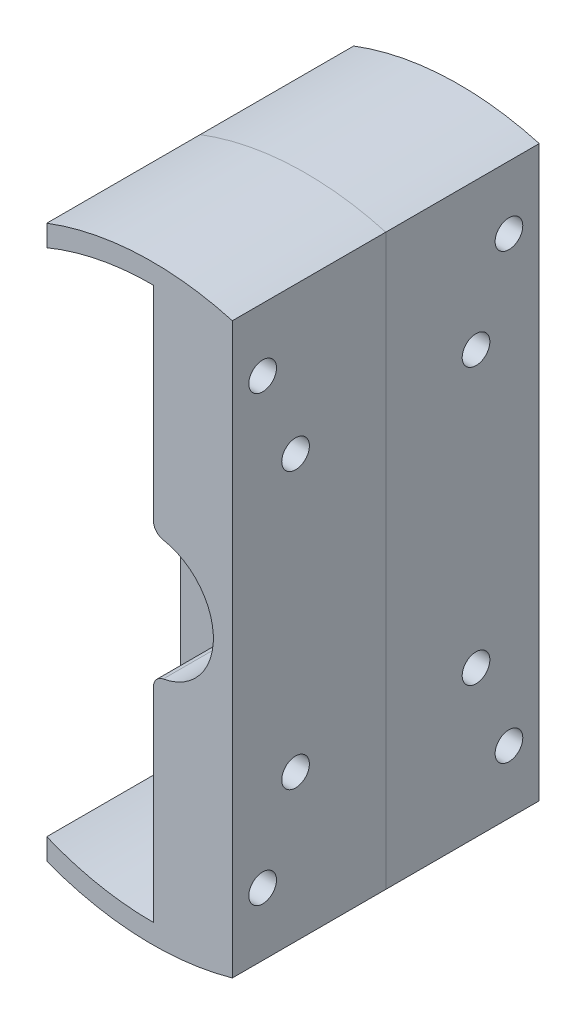
ISO-10303-21;
HEADER;
FILE_DESCRIPTION(('STEP AP214'),'2;1');
FILE_NAME('part.step','',(''),(''),'','','');
FILE_SCHEMA(('AUTOMOTIVE_DESIGN { 1 0 10303 214 1 1 1 1 }'));
ENDSEC;
DATA;
#1=APPLICATION_CONTEXT('core data for automotive mechanical design processes');
#2=APPLICATION_PROTOCOL_DEFINITION('international standard','automotive_design',2000,#1);
#3=PRODUCT_CONTEXT('',#1,'mechanical');
#4=PRODUCT('Part','Part','',(#3));
#5=PRODUCT_RELATED_PRODUCT_CATEGORY('part','',(#4));
#6=PRODUCT_DEFINITION_FORMATION('','',#4);
#7=PRODUCT_DEFINITION_CONTEXT('part definition',#1,'design');
#8=PRODUCT_DEFINITION('design','',#6,#7);
#9=PRODUCT_DEFINITION_SHAPE('','',#8);
#10=(LENGTH_UNIT() NAMED_UNIT(*) SI_UNIT(.MILLI.,.METRE.));
#11=(NAMED_UNIT(*) PLANE_ANGLE_UNIT() SI_UNIT($,.RADIAN.));
#12=(NAMED_UNIT(*) SI_UNIT($,.STERADIAN.) SOLID_ANGLE_UNIT());
#13=UNCERTAINTY_MEASURE_WITH_UNIT(LENGTH_MEASURE(1.E-05),#10,'distance_accuracy_value','');
#14=(GEOMETRIC_REPRESENTATION_CONTEXT(3) GLOBAL_UNCERTAINTY_ASSIGNED_CONTEXT((#13)) GLOBAL_UNIT_ASSIGNED_CONTEXT((#10,
#11,#12)) REPRESENTATION_CONTEXT('',''));
#15=CARTESIAN_POINT('',(0.,0.,0.));
#16=DIRECTION('',(0.,0.,1.));
#17=DIRECTION('',(1.,0.,0.));
#18=AXIS2_PLACEMENT_3D('',#15,#16,#17);
#19=CARTESIAN_POINT('',(0.,0.,-26.3));
#20=DIRECTION('',(0.,0.,-1.));
#21=DIRECTION('',(1.,0.,0.));
#22=AXIS2_PLACEMENT_3D('',#19,#20,#21);
#23=CYLINDRICAL_SURFACE('',#22,41.9000000000003);
#24=CARTESIAN_POINT('',(0.,0.,-46.6));
#25=DIRECTION('',(0.,0.,1.));
#26=DIRECTION('',(1.,0.,0.));
#27=AXIS2_PLACEMENT_3D('',#24,#25,#26);
#28=CIRCLE('',#27,41.9000000000003);
#29=CARTESIAN_POINT('',(-16.,-38.7247982564147,-46.6));
#30=VERTEX_POINT('',#29);
#31=CARTESIAN_POINT('',(0.199999999998424,-41.8995226703125,-46.6));
#32=VERTEX_POINT('',#31);
#33=EDGE_CURVE('E168',#30,#32,#28,.T.);
#34=ORIENTED_EDGE('',*,*,#33,.F.);
#35=DIRECTION('',(0.,0.,-1.));
#36=VECTOR('',#35,1.);
#37=CARTESIAN_POINT('',(-16.,-38.7247982564147,-26.3));
#38=LINE('',#37,#36);
#39=CARTESIAN_POINT('',(-16.,-38.7247982564147,-26.3));
#40=VERTEX_POINT('',#39);
#41=EDGE_CURVE('E167',#40,#30,#38,.T.);
#42=ORIENTED_EDGE('',*,*,#41,.F.);
#43=CARTESIAN_POINT('',(0.,0.,-26.3));
#44=DIRECTION('',(0.,0.,1.));
#45=DIRECTION('',(1.,0.,0.));
#46=AXIS2_PLACEMENT_3D('',#43,#44,#45);
#47=CIRCLE('',#46,41.9000000000003);
#48=CARTESIAN_POINT('',(0.199999999998424,-41.8995226703125,-26.3));
#49=VERTEX_POINT('',#48);
#50=EDGE_CURVE('E196',#40,#49,#47,.T.);
#51=ORIENTED_EDGE('',*,*,#50,.T.);
#52=DIRECTION('',(0.,0.,-1.));
#53=VECTOR('',#52,1.);
#54=CARTESIAN_POINT('',(0.199999999998424,-41.8995226703125,-26.3));
#55=LINE('',#54,#53);
#56=EDGE_CURVE('E12',#49,#32,#55,.T.);
#57=ORIENTED_EDGE('',*,*,#56,.T.);
#58=EDGE_LOOP('',(#34,#42,#51,#57));
#59=FACE_BOUND('',#58,.T.);
#60=ADVANCED_FACE('F53',(#59),#23,.F.);
#61=CARTESIAN_POINT('',(0.199999999998424,-41.5000000000045,-26.3));
#62=DIRECTION('',(1.,0.,0.));
#63=DIRECTION('',(0.,0.,1.));
#64=AXIS2_PLACEMENT_3D('',#61,#62,#63);
#65=PLANE('',#64);
#66=CARTESIAN_POINT('',(0.199999999998424,-20.9183332061263,-37.));
#67=DIRECTION('',(1.,0.,0.));
#68=DIRECTION('',(0.,0.,-1.));
#69=AXIS2_PLACEMENT_3D('',#66,#67,#68);
#70=CIRCLE('',#69,2.1);
#71=CARTESIAN_POINT('',(0.199999999998424,-20.9183332061263,-39.1));
#72=VERTEX_POINT('',#71);
#73=EDGE_CURVE('E286',#72,#72,#70,.T.);
#74=ORIENTED_EDGE('',*,*,#73,.T.);
#75=EDGE_LOOP('',(#74));
#76=FACE_BOUND('',#75,.T.);
#77=CARTESIAN_POINT('',(0.199999999998424,-33.6670833015316,-42.));
#78=DIRECTION('',(1.,0.,0.));
#79=DIRECTION('',(0.,0.,-1.));
#80=AXIS2_PLACEMENT_3D('',#77,#78,#79);
#81=CIRCLE('',#80,2.1);
#82=CARTESIAN_POINT('',(0.199999999998424,-33.6670833015316,-44.1));
#83=VERTEX_POINT('',#82);
#84=EDGE_CURVE('E291',#83,#83,#81,.T.);
#85=ORIENTED_EDGE('',*,*,#84,.T.);
#86=EDGE_LOOP('',(#85));
#87=FACE_BOUND('',#86,.T.);
#88=DIRECTION('',(0.,1.,0.));
#89=VECTOR('',#88,1.);
#90=CARTESIAN_POINT('',(0.199999999998424,-41.5000000000045,-46.6));
#91=LINE('',#90,#89);
#92=CARTESIAN_POINT('',(0.199999999998421,-10.9183332061265,-46.6));
#93=VERTEX_POINT('',#92);
#94=EDGE_CURVE('E170',#32,#93,#91,.T.);
#95=ORIENTED_EDGE('',*,*,#94,.F.);
#96=ORIENTED_EDGE('',*,*,#56,.F.);
#97=DIRECTION('',(0.,-1.,0.));
#98=VECTOR('',#97,1.);
#99=CARTESIAN_POINT('',(0.199999999998424,-41.5000000000045,-26.3));
#100=LINE('',#99,#98);
#101=CARTESIAN_POINT('',(0.199999999998421,-10.9183332061265,-26.3));
#102=VERTEX_POINT('',#101);
#103=EDGE_CURVE('E122',#102,#49,#100,.T.);
#104=ORIENTED_EDGE('',*,*,#103,.F.);
#105=DIRECTION('',(0.,0.,-1.));
#106=VECTOR('',#105,1.);
#107=CARTESIAN_POINT('',(0.199999999998421,-10.9183332061265,-26.3));
#108=LINE('',#107,#106);
#109=EDGE_CURVE('E61',#102,#93,#108,.T.);
#110=ORIENTED_EDGE('',*,*,#109,.T.);
#111=EDGE_LOOP('',(#95,#96,#104,#110));
#112=FACE_BOUND('',#111,.T.);
#113=ADVANCED_FACE('F219',(#76,#87,#112),#65,.F.);
#114=CARTESIAN_POINT('',(1.99999999999835,-10.9183332061264,-26.3));
#115=DIRECTION('',(0.,0.,-1.));
#116=DIRECTION('',(1.,0.,0.));
#117=AXIS2_PLACEMENT_3D('',#114,#115,#116);
#118=CYLINDRICAL_SURFACE('',#117,1.79999999999993);
#119=CARTESIAN_POINT('',(1.99999999999835,-10.9183332061264,-46.6));
#120=DIRECTION('',(0.,0.,1.));
#121=DIRECTION('',(1.,0.,0.));
#122=AXIS2_PLACEMENT_3D('',#119,#120,#121);
#123=CIRCLE('',#122,1.79999999999993);
#124=CARTESIAN_POINT('',(1.67567567567574,-9.14779268621378,-46.6));
#125=VERTEX_POINT('',#124);
#126=EDGE_CURVE('E174',#125,#93,#123,.T.);
#127=ORIENTED_EDGE('',*,*,#126,.T.);
#128=ORIENTED_EDGE('',*,*,#109,.F.);
#129=CARTESIAN_POINT('',(1.99999999999835,-10.9183332061264,-26.3));
#130=DIRECTION('',(0.,0.,1.));
#131=DIRECTION('',(1.,0.,0.));
#132=AXIS2_PLACEMENT_3D('',#129,#130,#131);
#133=CIRCLE('',#132,1.79999999999993);
#134=CARTESIAN_POINT('',(1.67567567567574,-9.14779268621378,-26.3));
#135=VERTEX_POINT('',#134);
#136=EDGE_CURVE('E162',#135,#102,#133,.T.);
#137=ORIENTED_EDGE('',*,*,#136,.F.);
#138=DIRECTION('',(0.,0.,-1.));
#139=VECTOR('',#138,1.);
#140=CARTESIAN_POINT('',(1.67567567567574,-9.14779268621378,-26.3));
#141=LINE('',#140,#139);
#142=EDGE_CURVE('E214',#135,#125,#141,.T.);
#143=ORIENTED_EDGE('',*,*,#142,.T.);
#144=EDGE_LOOP('',(#127,#128,#137,#143));
#145=FACE_BOUND('',#144,.T.);
#146=ADVANCED_FACE('F234',(#145),#118,.T.);
#147=CARTESIAN_POINT('',(0.,0.,-26.3));
#148=DIRECTION('',(0.,0.,-1.));
#149=DIRECTION('',(1.,0.,0.));
#150=AXIS2_PLACEMENT_3D('',#147,#148,#149);
#151=CYLINDRICAL_SURFACE('',#150,9.29999999999988);
#152=CARTESIAN_POINT('',(0.,0.,-46.6));
#153=DIRECTION('',(0.,0.,1.));
#154=DIRECTION('',(1.,0.,0.));
#155=AXIS2_PLACEMENT_3D('',#152,#153,#154);
#156=CIRCLE('',#155,9.29999999999988);
#157=CARTESIAN_POINT('',(1.67567567567442,9.14779268621401,-46.6));
#158=VERTEX_POINT('',#157);
#159=EDGE_CURVE('E176',#125,#158,#156,.T.);
#160=ORIENTED_EDGE('',*,*,#159,.F.);
#161=ORIENTED_EDGE('',*,*,#142,.F.);
#162=CARTESIAN_POINT('',(0.,0.,-26.3));
#163=DIRECTION('',(0.,0.,1.));
#164=DIRECTION('',(1.,0.,0.));
#165=AXIS2_PLACEMENT_3D('',#162,#163,#164);
#166=CIRCLE('',#165,9.29999999999988);
#167=CARTESIAN_POINT('',(1.67567567567442,9.14779268621401,-26.3));
#168=VERTEX_POINT('',#167);
#169=EDGE_CURVE('E160',#135,#168,#166,.T.);
#170=ORIENTED_EDGE('',*,*,#169,.T.);
#171=DIRECTION('',(0.,0.,-1.));
#172=VECTOR('',#171,1.);
#173=CARTESIAN_POINT('',(1.67567567567442,9.14779268621401,-26.3));
#174=LINE('',#173,#172);
#175=EDGE_CURVE('E154',#168,#158,#174,.T.);
#176=ORIENTED_EDGE('',*,*,#175,.T.);
#177=EDGE_LOOP('',(#160,#161,#170,#176));
#178=FACE_BOUND('',#177,.T.);
#179=ADVANCED_FACE('F236',(#178),#151,.F.);
#180=CARTESIAN_POINT('',(1.99999999999897,10.9183332061269,-26.3));
#181=DIRECTION('',(0.,0.,-1.));
#182=DIRECTION('',(1.,0.,0.));
#183=AXIS2_PLACEMENT_3D('',#180,#181,#182);
#184=CYLINDRICAL_SURFACE('',#183,1.80000000000055);
#185=CARTESIAN_POINT('',(1.99999999999897,10.9183332061269,-46.6));
#186=DIRECTION('',(0.,0.,1.));
#187=DIRECTION('',(1.,0.,0.));
#188=AXIS2_PLACEMENT_3D('',#185,#186,#187);
#189=CIRCLE('',#188,1.80000000000055);
#190=CARTESIAN_POINT('',(0.199999999998424,10.9183332061269,-46.6));
#191=VERTEX_POINT('',#190);
#192=EDGE_CURVE('E179',#191,#158,#189,.T.);
#193=ORIENTED_EDGE('',*,*,#192,.T.);
#194=ORIENTED_EDGE('',*,*,#175,.F.);
#195=CARTESIAN_POINT('',(1.99999999999897,10.9183332061269,-26.3));
#196=DIRECTION('',(0.,0.,1.));
#197=DIRECTION('',(1.,0.,0.));
#198=AXIS2_PLACEMENT_3D('',#195,#196,#197);
#199=CIRCLE('',#198,1.80000000000055);
#200=CARTESIAN_POINT('',(0.199999999998424,10.9183332061269,-26.3));
#201=VERTEX_POINT('',#200);
#202=EDGE_CURVE('E139',#201,#168,#199,.T.);
#203=ORIENTED_EDGE('',*,*,#202,.F.);
#204=DIRECTION('',(0.,0.,-1.));
#205=VECTOR('',#204,1.);
#206=CARTESIAN_POINT('',(0.199999999998424,10.9183332061269,-26.3));
#207=LINE('',#206,#205);
#208=EDGE_CURVE('E148',#201,#191,#207,.T.);
#209=ORIENTED_EDGE('',*,*,#208,.T.);
#210=EDGE_LOOP('',(#193,#194,#203,#209));
#211=FACE_BOUND('',#210,.T.);
#212=ADVANCED_FACE('F157',(#211),#184,.T.);
#213=CARTESIAN_POINT('',(0.199999999998424,41.5,-26.3));
#214=DIRECTION('',(1.,0.,0.));
#215=DIRECTION('',(0.,0.,1.));
#216=AXIS2_PLACEMENT_3D('',#213,#214,#215);
#217=PLANE('',#216);
#218=CARTESIAN_POINT('',(0.199999999998424,33.6670833015316,-42.));
#219=DIRECTION('',(1.,0.,0.));
#220=DIRECTION('',(0.,0.,-1.));
#221=AXIS2_PLACEMENT_3D('',#218,#219,#220);
#222=CIRCLE('',#221,2.09999999999999);
#223=CARTESIAN_POINT('',(0.199999999998424,33.6670833015316,-44.1));
#224=VERTEX_POINT('',#223);
#225=EDGE_CURVE('E277',#224,#224,#222,.T.);
#226=ORIENTED_EDGE('',*,*,#225,.T.);
#227=EDGE_LOOP('',(#226));
#228=FACE_BOUND('',#227,.T.);
#229=CARTESIAN_POINT('',(0.199999999998424,20.9183332061263,-37.));
#230=DIRECTION('',(1.,0.,0.));
#231=DIRECTION('',(0.,0.,-1.));
#232=AXIS2_PLACEMENT_3D('',#229,#230,#231);
#233=CIRCLE('',#232,2.1);
#234=CARTESIAN_POINT('',(0.199999999998424,20.9183332061263,-39.1));
#235=VERTEX_POINT('',#234);
#236=EDGE_CURVE('E280',#235,#235,#233,.T.);
#237=ORIENTED_EDGE('',*,*,#236,.T.);
#238=EDGE_LOOP('',(#237));
#239=FACE_BOUND('',#238,.T.);
#240=DIRECTION('',(0.,1.,0.));
#241=VECTOR('',#240,1.);
#242=CARTESIAN_POINT('',(0.199999999998424,41.5,-46.6));
#243=LINE('',#242,#241);
#244=CARTESIAN_POINT('',(0.199999999998425,41.8995226703124,-46.6));
#245=VERTEX_POINT('',#244);
#246=EDGE_CURVE('E151',#191,#245,#243,.T.);
#247=ORIENTED_EDGE('',*,*,#246,.F.);
#248=ORIENTED_EDGE('',*,*,#208,.F.);
#249=DIRECTION('',(0.,-1.,0.));
#250=VECTOR('',#249,1.);
#251=CARTESIAN_POINT('',(0.199999999998424,41.5,-26.3));
#252=LINE('',#251,#250);
#253=CARTESIAN_POINT('',(0.199999999998425,41.8995226703124,-26.3));
#254=VERTEX_POINT('',#253);
#255=EDGE_CURVE('E135',#254,#201,#252,.T.);
#256=ORIENTED_EDGE('',*,*,#255,.F.);
#257=DIRECTION('',(0.,0.,-1.));
#258=VECTOR('',#257,1.);
#259=CARTESIAN_POINT('',(0.199999999998425,41.8995226703124,-26.3));
#260=LINE('',#259,#258);
#261=EDGE_CURVE('E155',#254,#245,#260,.T.);
#262=ORIENTED_EDGE('',*,*,#261,.T.);
#263=EDGE_LOOP('',(#247,#248,#256,#262));
#264=FACE_BOUND('',#263,.T.);
#265=ADVANCED_FACE('F149',(#228,#239,#264),#217,.F.);
#266=CARTESIAN_POINT('',(0.,0.,-26.3));
#267=DIRECTION('',(0.,0.,-1.));
#268=DIRECTION('',(1.,0.,0.));
#269=AXIS2_PLACEMENT_3D('',#266,#267,#268);
#270=CYLINDRICAL_SURFACE('',#269,41.9000000000003);
#271=CARTESIAN_POINT('',(0.,0.,-46.6));
#272=DIRECTION('',(0.,0.,1.));
#273=DIRECTION('',(1.,0.,0.));
#274=AXIS2_PLACEMENT_3D('',#271,#272,#273);
#275=CIRCLE('',#274,41.9000000000003);
#276=CARTESIAN_POINT('',(-16.,38.7247982564147,-46.6));
#277=VERTEX_POINT('',#276);
#278=EDGE_CURVE('E182',#245,#277,#275,.T.);
#279=ORIENTED_EDGE('',*,*,#278,.F.);
#280=ORIENTED_EDGE('',*,*,#261,.F.);
#281=CARTESIAN_POINT('',(0.,0.,-26.3));
#282=DIRECTION('',(0.,0.,1.));
#283=DIRECTION('',(1.,0.,0.));
#284=AXIS2_PLACEMENT_3D('',#281,#282,#283);
#285=CIRCLE('',#284,41.9000000000003);
#286=CARTESIAN_POINT('',(-16.,38.7247982564147,-26.3));
#287=VERTEX_POINT('',#286);
#288=EDGE_CURVE('E142',#254,#287,#285,.T.);
#289=ORIENTED_EDGE('',*,*,#288,.T.);
#290=DIRECTION('',(0.,0.,-1.));
#291=VECTOR('',#290,1.);
#292=CARTESIAN_POINT('',(-16.,38.7247982564147,-26.3));
#293=LINE('',#292,#291);
#294=EDGE_CURVE('E209',#287,#277,#293,.T.);
#295=ORIENTED_EDGE('',*,*,#294,.T.);
#296=EDGE_LOOP('',(#279,#280,#289,#295));
#297=FACE_BOUND('',#296,.T.);
#298=ADVANCED_FACE('F239',(#297),#270,.F.);
#299=CARTESIAN_POINT('',(0.,0.,-26.3));
#300=DIRECTION('',(0.,0.,-1.));
#301=DIRECTION('',(1.,0.,0.));
#302=AXIS2_PLACEMENT_3D('',#299,#300,#301);
#303=CYLINDRICAL_SURFACE('',#302,44.9000000000002);
#304=CARTESIAN_POINT('',(0.,0.,-46.6));
#305=DIRECTION('',(0.,0.,1.));
#306=DIRECTION('',(1.,0.,0.));
#307=AXIS2_PLACEMENT_3D('',#304,#305,#306);
#308=CIRCLE('',#307,44.9000000000002);
#309=CARTESIAN_POINT('',(12.1812643297985,43.2160479373993,-46.6));
#310=VERTEX_POINT('',#309);
#311=CARTESIAN_POINT('',(-16.,41.9524731094606,-46.6));
#312=VERTEX_POINT('',#311);
#313=EDGE_CURVE('E187',#310,#312,#308,.T.);
#314=ORIENTED_EDGE('',*,*,#313,.T.);
#315=DIRECTION('',(0.,0.,-1.));
#316=VECTOR('',#315,1.);
#317=CARTESIAN_POINT('',(-16.,41.9524731094606,-26.3));
#318=LINE('',#317,#316);
#319=CARTESIAN_POINT('',(-16.,41.9524731094606,-23.3));
#320=VERTEX_POINT('',#319);
#321=EDGE_CURVE('E206',#320,#312,#318,.T.);
#322=ORIENTED_EDGE('',*,*,#321,.F.);
#323=CARTESIAN_POINT('',(0.,0.,-23.3));
#324=DIRECTION('',(0.,0.,-1.));
#325=DIRECTION('',(1.,0.,0.));
#326=AXIS2_PLACEMENT_3D('',#323,#324,#325);
#327=CIRCLE('',#326,44.9000000000002);
#328=CARTESIAN_POINT('',(12.1812643297985,43.2160479373993,-23.3));
#329=VERTEX_POINT('',#328);
#330=EDGE_CURVE('E260',#320,#329,#327,.T.);
#331=ORIENTED_EDGE('',*,*,#330,.T.);
#332=DIRECTION('',(0.,0.,-1.));
#333=VECTOR('',#332,1.);
#334=CARTESIAN_POINT('',(12.1812643297985,43.2160479373993,-26.3));
#335=LINE('',#334,#333);
#336=EDGE_CURVE('E203',#329,#310,#335,.T.);
#337=ORIENTED_EDGE('',*,*,#336,.T.);
#338=EDGE_LOOP('',(#314,#322,#331,#337));
#339=FACE_BOUND('',#338,.T.);
#340=ADVANCED_FACE('F269',(#339),#303,.T.);
#341=CARTESIAN_POINT('',(12.1812643297985,43.2160479373993,-26.3));
#342=DIRECTION('',(-1.,0.,0.));
#343=DIRECTION('',(0.,0.,-1.));
#344=AXIS2_PLACEMENT_3D('',#341,#342,#343);
#345=PLANE('',#344);
#346=CARTESIAN_POINT('',(12.1812643297985,33.6670833015316,-42.));
#347=DIRECTION('',(1.,0.,0.));
#348=DIRECTION('',(0.,0.,-1.));
#349=AXIS2_PLACEMENT_3D('',#346,#347,#348);
#350=CIRCLE('',#349,2.09999999999999);
#351=CARTESIAN_POINT('',(12.1812643297985,33.6670833015316,-44.1));
#352=VERTEX_POINT('',#351);
#353=EDGE_CURVE('E171',#352,#352,#350,.T.);
#354=ORIENTED_EDGE('',*,*,#353,.F.);
#355=EDGE_LOOP('',(#354));
#356=FACE_BOUND('',#355,.T.);
#357=CARTESIAN_POINT('',(12.1812643297985,20.9183332061263,-37.));
#358=DIRECTION('',(1.,0.,0.));
#359=DIRECTION('',(0.,0.,-1.));
#360=AXIS2_PLACEMENT_3D('',#357,#358,#359);
#361=CIRCLE('',#360,2.1);
#362=CARTESIAN_POINT('',(12.1812643297985,20.9183332061263,-39.1));
#363=VERTEX_POINT('',#362);
#364=EDGE_CURVE('E283',#363,#363,#361,.T.);
#365=ORIENTED_EDGE('',*,*,#364,.F.);
#366=EDGE_LOOP('',(#365));
#367=FACE_BOUND('',#366,.T.);
#368=CARTESIAN_POINT('',(12.1812643297985,-20.9183332061263,-37.));
#369=DIRECTION('',(1.,0.,0.));
#370=DIRECTION('',(0.,0.,-1.));
#371=AXIS2_PLACEMENT_3D('',#368,#369,#370);
#372=CIRCLE('',#371,2.1);
#373=CARTESIAN_POINT('',(12.1812643297985,-20.9183332061263,-39.1));
#374=VERTEX_POINT('',#373);
#375=EDGE_CURVE('E289',#374,#374,#372,.T.);
#376=ORIENTED_EDGE('',*,*,#375,.F.);
#377=EDGE_LOOP('',(#376));
#378=FACE_BOUND('',#377,.T.);
#379=CARTESIAN_POINT('',(12.1812643297985,-33.6670833015316,-42.));
#380=DIRECTION('',(1.,0.,0.));
#381=DIRECTION('',(0.,0.,-1.));
#382=AXIS2_PLACEMENT_3D('',#379,#380,#381);
#383=CIRCLE('',#382,2.1);
#384=CARTESIAN_POINT('',(12.1812643297985,-33.6670833015316,-44.1));
#385=VERTEX_POINT('',#384);
#386=EDGE_CURVE('E231',#385,#385,#383,.T.);
#387=ORIENTED_EDGE('',*,*,#386,.F.);
#388=EDGE_LOOP('',(#387));
#389=FACE_BOUND('',#388,.T.);
#390=DIRECTION('',(0.,-1.,0.));
#391=VECTOR('',#390,1.);
#392=CARTESIAN_POINT('',(12.1812643297985,43.2160479373993,-46.6));
#393=LINE('',#392,#391);
#394=CARTESIAN_POINT('',(12.1812643297985,-43.2160479373995,-46.6));
#395=VERTEX_POINT('',#394);
#396=EDGE_CURVE('E190',#310,#395,#393,.T.);
#397=ORIENTED_EDGE('',*,*,#396,.F.);
#398=ORIENTED_EDGE('',*,*,#336,.F.);
#399=DIRECTION('',(0.,-1.,0.));
#400=VECTOR('',#399,1.);
#401=CARTESIAN_POINT('',(12.1812643297985,43.2160479373993,-23.3));
#402=LINE('',#401,#400);
#403=CARTESIAN_POINT('',(12.1812643297985,-43.2160479373995,-23.3));
#404=VERTEX_POINT('',#403);
#405=EDGE_CURVE('E256',#329,#404,#402,.T.);
#406=ORIENTED_EDGE('',*,*,#405,.T.);
#407=DIRECTION('',(0.,0.,-1.));
#408=VECTOR('',#407,1.);
#409=CARTESIAN_POINT('',(12.1812643297985,-43.2160479373995,-26.3));
#410=LINE('',#409,#408);
#411=EDGE_CURVE('E200',#404,#395,#410,.T.);
#412=ORIENTED_EDGE('',*,*,#411,.T.);
#413=EDGE_LOOP('',(#397,#398,#406,#412));
#414=FACE_BOUND('',#413,.T.);
#415=ADVANCED_FACE('F267',(#356,#367,#378,#389,#414),#345,.F.);
#416=CARTESIAN_POINT('',(0.,0.,-26.3));
#417=DIRECTION('',(0.,0.,-1.));
#418=DIRECTION('',(1.,0.,0.));
#419=AXIS2_PLACEMENT_3D('',#416,#417,#418);
#420=CYLINDRICAL_SURFACE('',#419,44.9000000000003);
#421=CARTESIAN_POINT('',(0.,0.,-46.6));
#422=DIRECTION('',(0.,0.,1.));
#423=DIRECTION('',(1.,0.,0.));
#424=AXIS2_PLACEMENT_3D('',#421,#422,#423);
#425=CIRCLE('',#424,44.9000000000003);
#426=CARTESIAN_POINT('',(-16.,-41.9524731094607,-46.6));
#427=VERTEX_POINT('',#426);
#428=EDGE_CURVE('E193',#427,#395,#425,.T.);
#429=ORIENTED_EDGE('',*,*,#428,.T.);
#430=ORIENTED_EDGE('',*,*,#411,.F.);
#431=CARTESIAN_POINT('',(1.31838984174237E-13,8.18789480661053E-13,-23.3));
#432=DIRECTION('',(0.,0.,-1.));
#433=DIRECTION('',(-1.,0.,0.));
#434=AXIS2_PLACEMENT_3D('',#431,#432,#433);
#435=CIRCLE('',#434,44.9000000000011);
#436=CARTESIAN_POINT('',(-16.,-41.9524731094608,-23.3));
#437=VERTEX_POINT('',#436);
#438=EDGE_CURVE('E263',#404,#437,#435,.T.);
#439=ORIENTED_EDGE('',*,*,#438,.T.);
#440=DIRECTION('',(0.,0.,-1.));
#441=VECTOR('',#440,1.);
#442=CARTESIAN_POINT('',(-16.,-41.9524731094607,-26.3));
#443=LINE('',#442,#441);
#444=EDGE_CURVE('E198',#437,#427,#443,.T.);
#445=ORIENTED_EDGE('',*,*,#444,.T.);
#446=EDGE_LOOP('',(#429,#430,#439,#445));
#447=FACE_BOUND('',#446,.T.);
#448=ADVANCED_FACE('F302',(#447),#420,.T.);
#449=CARTESIAN_POINT('',(-16.,-38.7247982564147,-26.3));
#450=DIRECTION('',(-1.,0.,0.));
#451=DIRECTION('',(0.,0.,-1.));
#452=AXIS2_PLACEMENT_3D('',#449,#450,#451);
#453=PLANE('',#452);
#454=DIRECTION('',(0.,-1.,0.));
#455=VECTOR('',#454,1.);
#456=CARTESIAN_POINT('',(-16.,-38.7247982564147,-46.6));
#457=LINE('',#456,#455);
#458=EDGE_CURVE('E110',#30,#427,#457,.T.);
#459=ORIENTED_EDGE('',*,*,#458,.T.);
#460=ORIENTED_EDGE('',*,*,#444,.F.);
#461=DIRECTION('',(0.,1.,0.));
#462=VECTOR('',#461,1.);
#463=CARTESIAN_POINT('',(-16.,41.9524731094606,-23.3));
#464=LINE('',#463,#462);
#465=EDGE_CURVE('E245',#437,#320,#464,.T.);
#466=ORIENTED_EDGE('',*,*,#465,.T.);
#467=ORIENTED_EDGE('',*,*,#321,.T.);
#468=DIRECTION('',(0.,-1.,0.));
#469=VECTOR('',#468,1.);
#470=CARTESIAN_POINT('',(-16.,41.9524731094606,-46.6));
#471=LINE('',#470,#469);
#472=EDGE_CURVE('E185',#312,#277,#471,.T.);
#473=ORIENTED_EDGE('',*,*,#472,.T.);
#474=ORIENTED_EDGE('',*,*,#294,.F.);
#475=DIRECTION('',(0.,1.,0.));
#476=VECTOR('',#475,1.);
#477=CARTESIAN_POINT('',(-16.,41.9524731094606,-26.3));
#478=LINE('',#477,#476);
#479=EDGE_CURVE('E69',#40,#287,#478,.T.);
#480=ORIENTED_EDGE('',*,*,#479,.F.);
#481=ORIENTED_EDGE('',*,*,#41,.T.);
#482=EDGE_LOOP('',(#459,#460,#466,#467,#473,#474,#480,#481));
#483=FACE_BOUND('',#482,.T.);
#484=ADVANCED_FACE('F240',(#483),#453,.T.);
#485=CARTESIAN_POINT('',(0.,0.,-46.6));
#486=DIRECTION('',(0.,0.,-1.));
#487=DIRECTION('',(1.,0.,0.));
#488=AXIS2_PLACEMENT_3D('',#485,#486,#487);
#489=PLANE('',#488);
#490=ORIENTED_EDGE('',*,*,#33,.T.);
#491=ORIENTED_EDGE('',*,*,#94,.T.);
#492=ORIENTED_EDGE('',*,*,#126,.F.);
#493=ORIENTED_EDGE('',*,*,#159,.T.);
#494=ORIENTED_EDGE('',*,*,#192,.F.);
#495=ORIENTED_EDGE('',*,*,#246,.T.);
#496=ORIENTED_EDGE('',*,*,#278,.T.);
#497=ORIENTED_EDGE('',*,*,#472,.F.);
#498=ORIENTED_EDGE('',*,*,#313,.F.);
#499=ORIENTED_EDGE('',*,*,#396,.T.);
#500=ORIENTED_EDGE('',*,*,#428,.F.);
#501=ORIENTED_EDGE('',*,*,#458,.F.);
#502=EDGE_LOOP('',(#490,#491,#492,#493,#494,#495,#496,#497,#498,#499,#500,#501));
#503=FACE_BOUND('',#502,.T.);
#504=ADVANCED_FACE('F223',(#503),#489,.T.);
#505=CARTESIAN_POINT('',(12.1812643297985,-33.6670833015316,-42.));
#506=DIRECTION('',(-1.,0.,0.));
#507=DIRECTION('',(0.,0.,-1.));
#508=AXIS2_PLACEMENT_3D('',#505,#506,#507);
#509=CYLINDRICAL_SURFACE('',#508,2.1);
#510=ORIENTED_EDGE('',*,*,#386,.T.);
#511=EDGE_LOOP('',(#510));
#512=FACE_BOUND('',#511,.T.);
#513=ORIENTED_EDGE('',*,*,#84,.F.);
#514=EDGE_LOOP('',(#513));
#515=FACE_BOUND('',#514,.T.);
#516=ADVANCED_FACE('F298',(#512,#515),#509,.F.);
#517=CARTESIAN_POINT('',(12.1812643297985,-20.9183332061263,-37.));
#518=DIRECTION('',(-1.,0.,0.));
#519=DIRECTION('',(0.,0.,-1.));
#520=AXIS2_PLACEMENT_3D('',#517,#518,#519);
#521=CYLINDRICAL_SURFACE('',#520,2.1);
#522=ORIENTED_EDGE('',*,*,#375,.T.);
#523=EDGE_LOOP('',(#522));
#524=FACE_BOUND('',#523,.T.);
#525=ORIENTED_EDGE('',*,*,#73,.F.);
#526=EDGE_LOOP('',(#525));
#527=FACE_BOUND('',#526,.T.);
#528=ADVANCED_FACE('F394',(#524,#527),#521,.F.);
#529=CARTESIAN_POINT('',(12.1812643297985,20.9183332061263,-37.));
#530=DIRECTION('',(-1.,0.,0.));
#531=DIRECTION('',(0.,0.,-1.));
#532=AXIS2_PLACEMENT_3D('',#529,#530,#531);
#533=CYLINDRICAL_SURFACE('',#532,2.1);
#534=ORIENTED_EDGE('',*,*,#364,.T.);
#535=EDGE_LOOP('',(#534));
#536=FACE_BOUND('',#535,.T.);
#537=ORIENTED_EDGE('',*,*,#236,.F.);
#538=EDGE_LOOP('',(#537));
#539=FACE_BOUND('',#538,.T.);
#540=ADVANCED_FACE('F403',(#536,#539),#533,.F.);
#541=CARTESIAN_POINT('',(12.1812643297985,33.6670833015316,-42.));
#542=DIRECTION('',(-1.,0.,0.));
#543=DIRECTION('',(0.,0.,-1.));
#544=AXIS2_PLACEMENT_3D('',#541,#542,#543);
#545=CYLINDRICAL_SURFACE('',#544,2.09999999999999);
#546=ORIENTED_EDGE('',*,*,#353,.T.);
#547=EDGE_LOOP('',(#546));
#548=FACE_BOUND('',#547,.T.);
#549=ORIENTED_EDGE('',*,*,#225,.F.);
#550=EDGE_LOOP('',(#549));
#551=FACE_BOUND('',#550,.T.);
#552=ADVANCED_FACE('F413',(#548,#551),#545,.F.);
#553=CARTESIAN_POINT('',(0.,0.,-26.3));
#554=DIRECTION('',(0.,0.,-1.));
#555=DIRECTION('',(1.,0.,0.));
#556=AXIS2_PLACEMENT_3D('',#553,#554,#555);
#557=PLANE('',#556);
#558=ORIENTED_EDGE('',*,*,#479,.T.);
#559=ORIENTED_EDGE('',*,*,#288,.F.);
#560=ORIENTED_EDGE('',*,*,#255,.T.);
#561=ORIENTED_EDGE('',*,*,#202,.T.);
#562=ORIENTED_EDGE('',*,*,#169,.F.);
#563=ORIENTED_EDGE('',*,*,#136,.T.);
#564=ORIENTED_EDGE('',*,*,#103,.T.);
#565=ORIENTED_EDGE('',*,*,#50,.F.);
#566=EDGE_LOOP('',(#558,#559,#560,#561,#562,#563,#564,#565));
#567=FACE_BOUND('',#566,.T.);
#568=ADVANCED_FACE('F137',(#567),#557,.T.);
#569=CARTESIAN_POINT('',(0.,0.,-23.3));
#570=DIRECTION('',(0.,0.,-1.));
#571=DIRECTION('',(1.,0.,0.));
#572=AXIS2_PLACEMENT_3D('',#569,#570,#571);
#573=PLANE('',#572);
#574=ORIENTED_EDGE('',*,*,#330,.F.);
#575=ORIENTED_EDGE('',*,*,#465,.F.);
#576=ORIENTED_EDGE('',*,*,#438,.F.);
#577=ORIENTED_EDGE('',*,*,#405,.F.);
#578=EDGE_LOOP('',(#574,#575,#576,#577));
#579=FACE_BOUND('',#578,.T.);
#580=ADVANCED_FACE('F258',(#579),#573,.F.);
#581=CLOSED_SHELL('',(#60,#113,#146,#179,#212,#265,#298,#340,#415,#448,#484,#504,#516,#528,#540,
#552,#568,#580));
#582=MANIFOLD_SOLID_BREP('B2',#581);
#583=CARTESIAN_POINT('',(0.,0.,-20.3));
#584=DIRECTION('',(0.,0.,1.));
#585=DIRECTION('',(1.,0.,0.));
#586=AXIS2_PLACEMENT_3D('',#583,#584,#585);
#587=CYLINDRICAL_SURFACE('',#586,41.9000000000003);
#588=CARTESIAN_POINT('',(0.,0.,0.));
#589=DIRECTION('',(0.,0.,1.));
#590=DIRECTION('',(1.,0.,0.));
#591=AXIS2_PLACEMENT_3D('',#588,#589,#590);
#592=CIRCLE('',#591,41.9000000000003);
#593=CARTESIAN_POINT('',(-16.,-38.7247982564147,0.));
#594=VERTEX_POINT('',#593);
#595=CARTESIAN_POINT('',(0.199999999998424,-41.8995226703125,0.));
#596=VERTEX_POINT('',#595);
#597=EDGE_CURVE('E604',#594,#596,#592,.T.);
#598=ORIENTED_EDGE('',*,*,#597,.T.);
#599=DIRECTION('',(0.,0.,1.));
#600=VECTOR('',#599,1.);
#601=CARTESIAN_POINT('',(0.199999999998424,-41.8995226703125,-20.3));
#602=LINE('',#601,#600);
#603=CARTESIAN_POINT('',(0.199999999998424,-41.8995226703125,-20.3));
#604=VERTEX_POINT('',#603);
#605=EDGE_CURVE('E51',#604,#596,#602,.T.);
#606=ORIENTED_EDGE('',*,*,#605,.F.);
#607=CARTESIAN_POINT('',(0.,0.,-20.3));
#608=DIRECTION('',(0.,0.,1.));
#609=DIRECTION('',(1.,0.,0.));
#610=AXIS2_PLACEMENT_3D('',#607,#608,#609);
#611=CIRCLE('',#610,41.9000000000003);
#612=CARTESIAN_POINT('',(-16.,-38.7247982564147,-20.3));
#613=VERTEX_POINT('',#612);
#614=EDGE_CURVE('E637',#613,#604,#611,.T.);
#615=ORIENTED_EDGE('',*,*,#614,.F.);
#616=DIRECTION('',(0.,0.,1.));
#617=VECTOR('',#616,1.);
#618=CARTESIAN_POINT('',(-16.,-38.7247982564147,-20.3));
#619=LINE('',#618,#617);
#620=EDGE_CURVE('E506',#613,#594,#619,.T.);
#621=ORIENTED_EDGE('',*,*,#620,.T.);
#622=EDGE_LOOP('',(#598,#606,#615,#621));
#623=FACE_BOUND('',#622,.T.);
#624=ADVANCED_FACE('F490',(#623),#587,.F.);
#625=CARTESIAN_POINT('',(0.199999999998424,-41.5000000000045,-20.3));
#626=DIRECTION('',(1.,0.,0.));
#627=DIRECTION('',(0.,0.,-1.));
#628=AXIS2_PLACEMENT_3D('',#625,#626,#627);
#629=PLANE('',#628);
#630=CARTESIAN_POINT('',(0.199999999998424,-20.9183332061263,-9.60000000000002));
#631=DIRECTION('',(-1.,0.,0.));
#632=DIRECTION('',(0.,0.,1.));
#633=AXIS2_PLACEMENT_3D('',#630,#631,#632);
#634=CIRCLE('',#633,2.1);
#635=CARTESIAN_POINT('',(0.199999999998424,-20.9183332061263,-7.50000000000002));
#636=VERTEX_POINT('',#635);
#637=EDGE_CURVE('E678',#636,#636,#634,.T.);
#638=ORIENTED_EDGE('',*,*,#637,.F.);
#639=EDGE_LOOP('',(#638));
#640=FACE_BOUND('',#639,.T.);
#641=CARTESIAN_POINT('',(0.199999999998424,-33.6670833015316,-4.60000000000002));
#642=DIRECTION('',(-1.,0.,0.));
#643=DIRECTION('',(0.,0.,1.));
#644=AXIS2_PLACEMENT_3D('',#641,#642,#643);
#645=CIRCLE('',#644,2.1);
#646=CARTESIAN_POINT('',(0.199999999998424,-33.6670833015316,-2.50000000000002));
#647=VERTEX_POINT('',#646);
#648=EDGE_CURVE('E671',#647,#647,#645,.T.);
#649=ORIENTED_EDGE('',*,*,#648,.F.);
#650=EDGE_LOOP('',(#649));
#651=FACE_BOUND('',#650,.T.);
#652=DIRECTION('',(0.,1.,0.));
#653=VECTOR('',#652,1.);
#654=CARTESIAN_POINT('',(0.199999999998424,-41.5000000000045,0.));
#655=LINE('',#654,#653);
#656=CARTESIAN_POINT('',(0.199999999998421,-10.9183332061265,0.));
#657=VERTEX_POINT('',#656);
#658=EDGE_CURVE('E606',#596,#657,#655,.T.);
#659=ORIENTED_EDGE('',*,*,#658,.T.);
#660=DIRECTION('',(0.,0.,1.));
#661=VECTOR('',#660,1.);
#662=CARTESIAN_POINT('',(0.199999999998421,-10.9183332061265,-20.3));
#663=LINE('',#662,#661);
#664=CARTESIAN_POINT('',(0.199999999998421,-10.9183332061265,-20.3));
#665=VERTEX_POINT('',#664);
#666=EDGE_CURVE('E498',#665,#657,#663,.T.);
#667=ORIENTED_EDGE('',*,*,#666,.F.);
#668=DIRECTION('',(0.,-1.,0.));
#669=VECTOR('',#668,1.);
#670=CARTESIAN_POINT('',(0.199999999998424,-41.5000000000045,-20.3));
#671=LINE('',#670,#669);
#672=EDGE_CURVE('E664',#665,#604,#671,.T.);
#673=ORIENTED_EDGE('',*,*,#672,.T.);
#674=ORIENTED_EDGE('',*,*,#605,.T.);
#675=EDGE_LOOP('',(#659,#667,#673,#674));
#676=FACE_BOUND('',#675,.T.);
#677=ADVANCED_FACE('F657',(#640,#651,#676),#629,.F.);
#678=CARTESIAN_POINT('',(1.99999999999835,-10.9183332061264,-20.3));
#679=DIRECTION('',(0.,0.,1.));
#680=DIRECTION('',(1.,0.,0.));
#681=AXIS2_PLACEMENT_3D('',#678,#679,#680);
#682=CYLINDRICAL_SURFACE('',#681,1.79999999999993);
#683=CARTESIAN_POINT('',(1.99999999999835,-10.9183332061264,0.));
#684=DIRECTION('',(0.,0.,1.));
#685=DIRECTION('',(1.,0.,0.));
#686=AXIS2_PLACEMENT_3D('',#683,#684,#685);
#687=CIRCLE('',#686,1.79999999999993);
#688=CARTESIAN_POINT('',(1.67567567567574,-9.14779268621378,0.));
#689=VERTEX_POINT('',#688);
#690=EDGE_CURVE('E610',#689,#657,#687,.T.);
#691=ORIENTED_EDGE('',*,*,#690,.F.);
#692=DIRECTION('',(0.,0.,1.));
#693=VECTOR('',#692,1.);
#694=CARTESIAN_POINT('',(1.67567567567574,-9.14779268621378,-20.3));
#695=LINE('',#694,#693);
#696=CARTESIAN_POINT('',(1.67567567567574,-9.14779268621378,-20.3));
#697=VERTEX_POINT('',#696);
#698=EDGE_CURVE('E650',#697,#689,#695,.T.);
#699=ORIENTED_EDGE('',*,*,#698,.F.);
#700=CARTESIAN_POINT('',(1.99999999999835,-10.9183332061264,-20.3));
#701=DIRECTION('',(0.,0.,1.));
#702=DIRECTION('',(1.,0.,0.));
#703=AXIS2_PLACEMENT_3D('',#700,#701,#702);
#704=CIRCLE('',#703,1.79999999999993);
#705=EDGE_CURVE('E599',#697,#665,#704,.T.);
#706=ORIENTED_EDGE('',*,*,#705,.T.);
#707=ORIENTED_EDGE('',*,*,#666,.T.);
#708=EDGE_LOOP('',(#691,#699,#706,#707));
#709=FACE_BOUND('',#708,.T.);
#710=ADVANCED_FACE('F654',(#709),#682,.T.);
#711=CARTESIAN_POINT('',(0.,0.,-20.3));
#712=DIRECTION('',(0.,0.,1.));
#713=DIRECTION('',(1.,0.,0.));
#714=AXIS2_PLACEMENT_3D('',#711,#712,#713);
#715=CYLINDRICAL_SURFACE('',#714,9.29999999999988);
#716=CARTESIAN_POINT('',(0.,0.,0.));
#717=DIRECTION('',(0.,0.,1.));
#718=DIRECTION('',(1.,0.,0.));
#719=AXIS2_PLACEMENT_3D('',#716,#717,#718);
#720=CIRCLE('',#719,9.29999999999988);
#721=CARTESIAN_POINT('',(1.67567567567442,9.14779268621401,0.));
#722=VERTEX_POINT('',#721);
#723=EDGE_CURVE('E613',#689,#722,#720,.T.);
#724=ORIENTED_EDGE('',*,*,#723,.T.);
#725=DIRECTION('',(0.,0.,1.));
#726=VECTOR('',#725,1.);
#727=CARTESIAN_POINT('',(1.67567567567442,9.14779268621401,-20.3));
#728=LINE('',#727,#726);
#729=CARTESIAN_POINT('',(1.67567567567442,9.14779268621401,-20.3));
#730=VERTEX_POINT('',#729);
#731=EDGE_CURVE('E581',#730,#722,#728,.T.);
#732=ORIENTED_EDGE('',*,*,#731,.F.);
#733=CARTESIAN_POINT('',(0.,0.,-20.3));
#734=DIRECTION('',(0.,0.,1.));
#735=DIRECTION('',(1.,0.,0.));
#736=AXIS2_PLACEMENT_3D('',#733,#734,#735);
#737=CIRCLE('',#736,9.29999999999988);
#738=EDGE_CURVE('E597',#697,#730,#737,.T.);
#739=ORIENTED_EDGE('',*,*,#738,.F.);
#740=ORIENTED_EDGE('',*,*,#698,.T.);
#741=EDGE_LOOP('',(#724,#732,#739,#740));
#742=FACE_BOUND('',#741,.T.);
#743=ADVANCED_FACE('F662',(#742),#715,.F.);
#744=CARTESIAN_POINT('',(1.99999999999897,10.9183332061269,-20.3));
#745=DIRECTION('',(0.,0.,1.));
#746=DIRECTION('',(1.,0.,0.));
#747=AXIS2_PLACEMENT_3D('',#744,#745,#746);
#748=CYLINDRICAL_SURFACE('',#747,1.80000000000055);
#749=CARTESIAN_POINT('',(1.99999999999897,10.9183332061269,0.));
#750=DIRECTION('',(0.,0.,1.));
#751=DIRECTION('',(1.,0.,0.));
#752=AXIS2_PLACEMENT_3D('',#749,#750,#751);
#753=CIRCLE('',#752,1.80000000000055);
#754=CARTESIAN_POINT('',(0.199999999998424,10.9183332061269,0.));
#755=VERTEX_POINT('',#754);
#756=EDGE_CURVE('E579',#755,#722,#753,.T.);
#757=ORIENTED_EDGE('',*,*,#756,.F.);
#758=DIRECTION('',(0.,0.,1.));
#759=VECTOR('',#758,1.);
#760=CARTESIAN_POINT('',(0.199999999998424,10.9183332061269,-20.3));
#761=LINE('',#760,#759);
#762=CARTESIAN_POINT('',(0.199999999998424,10.9183332061269,-20.3));
#763=VERTEX_POINT('',#762);
#764=EDGE_CURVE('E572',#763,#755,#761,.T.);
#765=ORIENTED_EDGE('',*,*,#764,.F.);
#766=CARTESIAN_POINT('',(1.99999999999897,10.9183332061269,-20.3));
#767=DIRECTION('',(0.,0.,1.));
#768=DIRECTION('',(1.,0.,0.));
#769=AXIS2_PLACEMENT_3D('',#766,#767,#768);
#770=CIRCLE('',#769,1.80000000000055);
#771=EDGE_CURVE('E576',#763,#730,#770,.T.);
#772=ORIENTED_EDGE('',*,*,#771,.T.);
#773=ORIENTED_EDGE('',*,*,#731,.T.);
#774=EDGE_LOOP('',(#757,#765,#772,#773));
#775=FACE_BOUND('',#774,.T.);
#776=ADVANCED_FACE('F574',(#775),#748,.T.);
#777=CARTESIAN_POINT('',(0.199999999998424,41.5,-20.3));
#778=DIRECTION('',(1.,0.,0.));
#779=DIRECTION('',(0.,0.,-1.));
#780=AXIS2_PLACEMENT_3D('',#777,#778,#779);
#781=PLANE('',#780);
#782=CARTESIAN_POINT('',(0.199999999998424,33.6670833015316,-4.60000000000002));
#783=DIRECTION('',(-1.,0.,0.));
#784=DIRECTION('',(0.,0.,1.));
#785=AXIS2_PLACEMENT_3D('',#782,#783,#784);
#786=CIRCLE('',#785,2.09999999999999);
#787=CARTESIAN_POINT('',(0.199999999998424,33.6670833015316,-2.50000000000003));
#788=VERTEX_POINT('',#787);
#789=EDGE_CURVE('E687',#788,#788,#786,.T.);
#790=ORIENTED_EDGE('',*,*,#789,.F.);
#791=EDGE_LOOP('',(#790));
#792=FACE_BOUND('',#791,.T.);
#793=CARTESIAN_POINT('',(0.199999999998424,20.9183332061263,-9.60000000000002));
#794=DIRECTION('',(-1.,0.,0.));
#795=DIRECTION('',(0.,0.,1.));
#796=AXIS2_PLACEMENT_3D('',#793,#794,#795);
#797=CIRCLE('',#796,2.1);
#798=CARTESIAN_POINT('',(0.199999999998424,20.9183332061263,-7.50000000000002));
#799=VERTEX_POINT('',#798);
#800=EDGE_CURVE('E684',#799,#799,#797,.T.);
#801=ORIENTED_EDGE('',*,*,#800,.F.);
#802=EDGE_LOOP('',(#801));
#803=FACE_BOUND('',#802,.T.);
#804=DIRECTION('',(0.,1.,0.));
#805=VECTOR('',#804,1.);
#806=CARTESIAN_POINT('',(0.199999999998424,41.5,0.));
#807=LINE('',#806,#805);
#808=CARTESIAN_POINT('',(0.199999999998425,41.8995226703124,0.));
#809=VERTEX_POINT('',#808);
#810=EDGE_CURVE('E617',#755,#809,#807,.T.);
#811=ORIENTED_EDGE('',*,*,#810,.T.);
#812=DIRECTION('',(0.,0.,1.));
#813=VECTOR('',#812,1.);
#814=CARTESIAN_POINT('',(0.199999999998425,41.8995226703124,-20.3));
#815=LINE('',#814,#813);
#816=CARTESIAN_POINT('',(0.199999999998425,41.8995226703124,-20.3));
#817=VERTEX_POINT('',#816);
#818=EDGE_CURVE('E582',#817,#809,#815,.T.);
#819=ORIENTED_EDGE('',*,*,#818,.F.);
#820=DIRECTION('',(0.,-1.,0.));
#821=VECTOR('',#820,1.);
#822=CARTESIAN_POINT('',(0.199999999998424,41.5,-20.3));
#823=LINE('',#822,#821);
#824=EDGE_CURVE('E585',#817,#763,#823,.T.);
#825=ORIENTED_EDGE('',*,*,#824,.T.);
#826=ORIENTED_EDGE('',*,*,#764,.T.);
#827=EDGE_LOOP('',(#811,#819,#825,#826));
#828=FACE_BOUND('',#827,.T.);
#829=ADVANCED_FACE('F586',(#792,#803,#828),#781,.F.);
#830=CARTESIAN_POINT('',(0.,0.,-20.3));
#831=DIRECTION('',(0.,0.,1.));
#832=DIRECTION('',(1.,0.,0.));
#833=AXIS2_PLACEMENT_3D('',#830,#831,#832);
#834=CYLINDRICAL_SURFACE('',#833,41.9000000000003);
#835=CARTESIAN_POINT('',(0.,0.,0.));
#836=DIRECTION('',(0.,0.,1.));
#837=DIRECTION('',(1.,0.,0.));
#838=AXIS2_PLACEMENT_3D('',#835,#836,#837);
#839=CIRCLE('',#838,41.9000000000003);
#840=CARTESIAN_POINT('',(-16.,38.7247982564147,0.));
#841=VERTEX_POINT('',#840);
#842=EDGE_CURVE('E619',#809,#841,#839,.T.);
#843=ORIENTED_EDGE('',*,*,#842,.T.);
#844=DIRECTION('',(0.,0.,1.));
#845=VECTOR('',#844,1.);
#846=CARTESIAN_POINT('',(-16.,38.7247982564147,-20.3));
#847=LINE('',#846,#845);
#848=CARTESIAN_POINT('',(-16.,38.7247982564147,-20.3));
#849=VERTEX_POINT('',#848);
#850=EDGE_CURVE('E646',#849,#841,#847,.T.);
#851=ORIENTED_EDGE('',*,*,#850,.F.);
#852=CARTESIAN_POINT('',(0.,0.,-20.3));
#853=DIRECTION('',(0.,0.,1.));
#854=DIRECTION('',(1.,0.,0.));
#855=AXIS2_PLACEMENT_3D('',#852,#853,#854);
#856=CIRCLE('',#855,41.9000000000003);
#857=EDGE_CURVE('E591',#817,#849,#856,.T.);
#858=ORIENTED_EDGE('',*,*,#857,.F.);
#859=ORIENTED_EDGE('',*,*,#818,.T.);
#860=EDGE_LOOP('',(#843,#851,#858,#859));
#861=FACE_BOUND('',#860,.T.);
#862=ADVANCED_FACE('F748',(#861),#834,.F.);
#863=CARTESIAN_POINT('',(0.,0.,-20.3));
#864=DIRECTION('',(0.,0.,1.));
#865=DIRECTION('',(1.,0.,0.));
#866=AXIS2_PLACEMENT_3D('',#863,#864,#865);
#867=CYLINDRICAL_SURFACE('',#866,44.9000000000002);
#868=CARTESIAN_POINT('',(0.,0.,0.));
#869=DIRECTION('',(0.,0.,1.));
#870=DIRECTION('',(1.,0.,0.));
#871=AXIS2_PLACEMENT_3D('',#868,#869,#870);
#872=CIRCLE('',#871,44.9000000000002);
#873=CARTESIAN_POINT('',(12.1812643297985,43.2160479373993,0.));
#874=VERTEX_POINT('',#873);
#875=CARTESIAN_POINT('',(-16.,41.9524731094606,0.));
#876=VERTEX_POINT('',#875);
#877=EDGE_CURVE('E625',#874,#876,#872,.T.);
#878=ORIENTED_EDGE('',*,*,#877,.F.);
#879=DIRECTION('',(0.,0.,1.));
#880=VECTOR('',#879,1.);
#881=CARTESIAN_POINT('',(12.1812643297985,43.2160479373993,-20.3));
#882=LINE('',#881,#880);
#883=CARTESIAN_POINT('',(12.1812643297985,43.2160479373993,-23.3));
#884=VERTEX_POINT('',#883);
#885=EDGE_CURVE('E642',#884,#874,#882,.T.);
#886=ORIENTED_EDGE('',*,*,#885,.F.);
#887=CARTESIAN_POINT('',(0.,0.,-23.3));
#888=DIRECTION('',(0.,0.,-1.));
#889=DIRECTION('',(1.,0.,0.));
#890=AXIS2_PLACEMENT_3D('',#887,#888,#889);
#891=CIRCLE('',#890,44.9000000000002);
#892=CARTESIAN_POINT('',(-16.,41.9524731094606,-23.3));
#893=VERTEX_POINT('',#892);
#894=EDGE_CURVE('E694',#893,#884,#891,.T.);
#895=ORIENTED_EDGE('',*,*,#894,.F.);
#896=DIRECTION('',(0.,0.,1.));
#897=VECTOR('',#896,1.);
#898=CARTESIAN_POINT('',(-16.,41.9524731094606,-20.3));
#899=LINE('',#898,#897);
#900=EDGE_CURVE('E644',#893,#876,#899,.T.);
#901=ORIENTED_EDGE('',*,*,#900,.T.);
#902=EDGE_LOOP('',(#878,#886,#895,#901));
#903=FACE_BOUND('',#902,.T.);
#904=ADVANCED_FACE('F716',(#903),#867,.T.);
#905=CARTESIAN_POINT('',(12.1812643297985,43.2160479373993,-20.3));
#906=DIRECTION('',(-1.,0.,0.));
#907=DIRECTION('',(0.,0.,1.));
#908=AXIS2_PLACEMENT_3D('',#905,#906,#907);
#909=PLANE('',#908);
#910=CARTESIAN_POINT('',(12.1812643297985,33.6670833015316,-4.60000000000002));
#911=DIRECTION('',(-1.,0.,0.));
#912=DIRECTION('',(0.,0.,1.));
#913=AXIS2_PLACEMENT_3D('',#910,#911,#912);
#914=CIRCLE('',#913,2.09999999999999);
#915=CARTESIAN_POINT('',(12.1812643297985,33.6670833015316,-2.50000000000003));
#916=VERTEX_POINT('',#915);
#917=EDGE_CURVE('E607',#916,#916,#914,.T.);
#918=ORIENTED_EDGE('',*,*,#917,.T.);
#919=EDGE_LOOP('',(#918));
#920=FACE_BOUND('',#919,.T.);
#921=CARTESIAN_POINT('',(12.1812643297985,20.9183332061263,-9.60000000000002));
#922=DIRECTION('',(-1.,0.,0.));
#923=DIRECTION('',(0.,0.,1.));
#924=AXIS2_PLACEMENT_3D('',#921,#922,#923);
#925=CIRCLE('',#924,2.1);
#926=CARTESIAN_POINT('',(12.1812643297985,20.9183332061263,-7.50000000000002));
#927=VERTEX_POINT('',#926);
#928=EDGE_CURVE('E681',#927,#927,#925,.T.);
#929=ORIENTED_EDGE('',*,*,#928,.T.);
#930=EDGE_LOOP('',(#929));
#931=FACE_BOUND('',#930,.T.);
#932=CARTESIAN_POINT('',(12.1812643297985,-20.9183332061263,-9.60000000000002));
#933=DIRECTION('',(-1.,0.,0.));
#934=DIRECTION('',(0.,0.,1.));
#935=AXIS2_PLACEMENT_3D('',#932,#933,#934);
#936=CIRCLE('',#935,2.1);
#937=CARTESIAN_POINT('',(12.1812643297985,-20.9183332061263,-7.50000000000002));
#938=VERTEX_POINT('',#937);
#939=EDGE_CURVE('E675',#938,#938,#936,.T.);
#940=ORIENTED_EDGE('',*,*,#939,.T.);
#941=EDGE_LOOP('',(#940));
#942=FACE_BOUND('',#941,.T.);
#943=CARTESIAN_POINT('',(12.1812643297985,-33.6670833015316,-4.60000000000002));
#944=DIRECTION('',(-1.,0.,0.));
#945=DIRECTION('',(0.,0.,1.));
#946=AXIS2_PLACEMENT_3D('',#943,#944,#945);
#947=CIRCLE('',#946,2.1);
#948=CARTESIAN_POINT('',(12.1812643297985,-33.6670833015316,-2.50000000000002));
#949=VERTEX_POINT('',#948);
#950=EDGE_CURVE('E668',#949,#949,#947,.T.);
#951=ORIENTED_EDGE('',*,*,#950,.T.);
#952=EDGE_LOOP('',(#951));
#953=FACE_BOUND('',#952,.T.);
#954=DIRECTION('',(0.,-1.,0.));
#955=VECTOR('',#954,1.);
#956=CARTESIAN_POINT('',(12.1812643297985,43.2160479373993,0.));
#957=LINE('',#956,#955);
#958=CARTESIAN_POINT('',(12.1812643297985,-43.2160479373995,0.));
#959=VERTEX_POINT('',#958);
#960=EDGE_CURVE('E628',#874,#959,#957,.T.);
#961=ORIENTED_EDGE('',*,*,#960,.T.);
#962=DIRECTION('',(0.,0.,1.));
#963=VECTOR('',#962,1.);
#964=CARTESIAN_POINT('',(12.1812643297985,-43.2160479373995,-20.3));
#965=LINE('',#964,#963);
#966=CARTESIAN_POINT('',(12.1812643297985,-43.2160479373995,-23.3));
#967=VERTEX_POINT('',#966);
#968=EDGE_CURVE('E640',#967,#959,#965,.T.);
#969=ORIENTED_EDGE('',*,*,#968,.F.);
#970=DIRECTION('',(0.,-1.,0.));
#971=VECTOR('',#970,1.);
#972=CARTESIAN_POINT('',(12.1812643297985,43.2160479373993,-23.3));
#973=LINE('',#972,#971);
#974=EDGE_CURVE('E700',#884,#967,#973,.T.);
#975=ORIENTED_EDGE('',*,*,#974,.F.);
#976=ORIENTED_EDGE('',*,*,#885,.T.);
#977=EDGE_LOOP('',(#961,#969,#975,#976));
#978=FACE_BOUND('',#977,.T.);
#979=ADVANCED_FACE('F725',(#920,#931,#942,#953,#978),#909,.F.);
#980=CARTESIAN_POINT('',(0.,0.,-20.3));
#981=DIRECTION('',(0.,0.,1.));
#982=DIRECTION('',(1.,0.,0.));
#983=AXIS2_PLACEMENT_3D('',#980,#981,#982);
#984=CYLINDRICAL_SURFACE('',#983,44.9000000000003);
#985=CARTESIAN_POINT('',(0.,0.,0.));
#986=DIRECTION('',(0.,0.,1.));
#987=DIRECTION('',(1.,0.,0.));
#988=AXIS2_PLACEMENT_3D('',#985,#986,#987);
#989=CIRCLE('',#988,44.9000000000003);
#990=CARTESIAN_POINT('',(-16.,-41.9524731094607,0.));
#991=VERTEX_POINT('',#990);
#992=EDGE_CURVE('E631',#991,#959,#989,.T.);
#993=ORIENTED_EDGE('',*,*,#992,.F.);
#994=DIRECTION('',(0.,0.,1.));
#995=VECTOR('',#994,1.);
#996=CARTESIAN_POINT('',(-16.,-41.9524731094607,-20.3));
#997=LINE('',#996,#995);
#998=CARTESIAN_POINT('',(-16.,-41.9524731094608,-23.3));
#999=VERTEX_POINT('',#998);
#1000=EDGE_CURVE('E547',#999,#991,#997,.T.);
#1001=ORIENTED_EDGE('',*,*,#1000,.F.);
#1002=CARTESIAN_POINT('',(1.31838984174237E-13,8.18789480661053E-13,-23.3));
#1003=DIRECTION('',(0.,0.,-1.));
#1004=DIRECTION('',(-1.,0.,0.));
#1005=AXIS2_PLACEMENT_3D('',#1002,#1003,#1004);
#1006=CIRCLE('',#1005,44.9000000000011);
#1007=EDGE_CURVE('E697',#967,#999,#1006,.T.);
#1008=ORIENTED_EDGE('',*,*,#1007,.F.);
#1009=ORIENTED_EDGE('',*,*,#968,.T.);
#1010=EDGE_LOOP('',(#993,#1001,#1008,#1009));
#1011=FACE_BOUND('',#1010,.T.);
#1012=ADVANCED_FACE('F728',(#1011),#984,.T.);
#1013=CARTESIAN_POINT('',(-16.,-38.7247982564147,-20.3));
#1014=DIRECTION('',(-1.,0.,0.));
#1015=DIRECTION('',(0.,0.,1.));
#1016=AXIS2_PLACEMENT_3D('',#1013,#1014,#1015);
#1017=PLANE('',#1016);
#1018=DIRECTION('',(0.,-1.,0.));
#1019=VECTOR('',#1018,1.);
#1020=CARTESIAN_POINT('',(-16.,-38.7247982564147,0.));
#1021=LINE('',#1020,#1019);
#1022=EDGE_CURVE('E634',#594,#991,#1021,.T.);
#1023=ORIENTED_EDGE('',*,*,#1022,.F.);
#1024=ORIENTED_EDGE('',*,*,#620,.F.);
#1025=DIRECTION('',(0.,1.,0.));
#1026=VECTOR('',#1025,1.);
#1027=CARTESIAN_POINT('',(-16.,41.9524731094606,-20.3));
#1028=LINE('',#1027,#1026);
#1029=EDGE_CURVE('E692',#613,#849,#1028,.T.);
#1030=ORIENTED_EDGE('',*,*,#1029,.T.);
#1031=ORIENTED_EDGE('',*,*,#850,.T.);
#1032=DIRECTION('',(0.,-1.,0.));
#1033=VECTOR('',#1032,1.);
#1034=CARTESIAN_POINT('',(-16.,41.9524731094606,0.));
#1035=LINE('',#1034,#1033);
#1036=EDGE_CURVE('E622',#876,#841,#1035,.T.);
#1037=ORIENTED_EDGE('',*,*,#1036,.F.);
#1038=ORIENTED_EDGE('',*,*,#900,.F.);
#1039=DIRECTION('',(0.,1.,0.));
#1040=VECTOR('',#1039,1.);
#1041=CARTESIAN_POINT('',(-16.,41.9524731094606,-23.3));
#1042=LINE('',#1041,#1040);
#1043=EDGE_CURVE('E672',#999,#893,#1042,.T.);
#1044=ORIENTED_EDGE('',*,*,#1043,.F.);
#1045=ORIENTED_EDGE('',*,*,#1000,.T.);
#1046=EDGE_LOOP('',(#1023,#1024,#1030,#1031,#1037,#1038,#1044,#1045));
#1047=FACE_BOUND('',#1046,.T.);
#1048=ADVANCED_FACE('F729',(#1047),#1017,.T.);
#1049=CARTESIAN_POINT('',(0.,0.,0.));
#1050=DIRECTION('',(0.,0.,1.));
#1051=DIRECTION('',(1.,0.,0.));
#1052=AXIS2_PLACEMENT_3D('',#1049,#1050,#1051);
#1053=PLANE('',#1052);
#1054=ORIENTED_EDGE('',*,*,#597,.F.);
#1055=ORIENTED_EDGE('',*,*,#1022,.T.);
#1056=ORIENTED_EDGE('',*,*,#992,.T.);
#1057=ORIENTED_EDGE('',*,*,#960,.F.);
#1058=ORIENTED_EDGE('',*,*,#877,.T.);
#1059=ORIENTED_EDGE('',*,*,#1036,.T.);
#1060=ORIENTED_EDGE('',*,*,#842,.F.);
#1061=ORIENTED_EDGE('',*,*,#810,.F.);
#1062=ORIENTED_EDGE('',*,*,#756,.T.);
#1063=ORIENTED_EDGE('',*,*,#723,.F.);
#1064=ORIENTED_EDGE('',*,*,#690,.T.);
#1065=ORIENTED_EDGE('',*,*,#658,.F.);
#1066=EDGE_LOOP('',(#1054,#1055,#1056,#1057,#1058,#1059,#1060,#1061,#1062,#1063,#1064,#1065));
#1067=FACE_BOUND('',#1066,.T.);
#1068=ADVANCED_FACE('F660',(#1067),#1053,.T.);
#1069=CARTESIAN_POINT('',(12.1812643297985,-33.6670833015316,-4.60000000000002));
#1070=DIRECTION('',(-1.,0.,0.));
#1071=DIRECTION('',(0.,0.,1.));
#1072=AXIS2_PLACEMENT_3D('',#1069,#1070,#1071);
#1073=CYLINDRICAL_SURFACE('',#1072,2.1);
#1074=ORIENTED_EDGE('',*,*,#950,.F.);
#1075=EDGE_LOOP('',(#1074));
#1076=FACE_BOUND('',#1075,.T.);
#1077=ORIENTED_EDGE('',*,*,#648,.T.);
#1078=EDGE_LOOP('',(#1077));
#1079=FACE_BOUND('',#1078,.T.);
#1080=ADVANCED_FACE('F737',(#1076,#1079),#1073,.F.);
#1081=CARTESIAN_POINT('',(12.1812643297985,-20.9183332061263,-9.60000000000002));
#1082=DIRECTION('',(-1.,0.,0.));
#1083=DIRECTION('',(0.,0.,1.));
#1084=AXIS2_PLACEMENT_3D('',#1081,#1082,#1083);
#1085=CYLINDRICAL_SURFACE('',#1084,2.1);
#1086=ORIENTED_EDGE('',*,*,#939,.F.);
#1087=EDGE_LOOP('',(#1086));
#1088=FACE_BOUND('',#1087,.T.);
#1089=ORIENTED_EDGE('',*,*,#637,.T.);
#1090=EDGE_LOOP('',(#1089));
#1091=FACE_BOUND('',#1090,.T.);
#1092=ADVANCED_FACE('F841',(#1088,#1091),#1085,.F.);
#1093=CARTESIAN_POINT('',(12.1812643297985,20.9183332061263,-9.60000000000002));
#1094=DIRECTION('',(-1.,0.,0.));
#1095=DIRECTION('',(0.,0.,1.));
#1096=AXIS2_PLACEMENT_3D('',#1093,#1094,#1095);
#1097=CYLINDRICAL_SURFACE('',#1096,2.1);
#1098=ORIENTED_EDGE('',*,*,#928,.F.);
#1099=EDGE_LOOP('',(#1098));
#1100=FACE_BOUND('',#1099,.T.);
#1101=ORIENTED_EDGE('',*,*,#800,.T.);
#1102=EDGE_LOOP('',(#1101));
#1103=FACE_BOUND('',#1102,.T.);
#1104=ADVANCED_FACE('F851',(#1100,#1103),#1097,.F.);
#1105=CARTESIAN_POINT('',(12.1812643297985,33.6670833015316,-4.60000000000002));
#1106=DIRECTION('',(-1.,0.,0.));
#1107=DIRECTION('',(0.,0.,1.));
#1108=AXIS2_PLACEMENT_3D('',#1105,#1106,#1107);
#1109=CYLINDRICAL_SURFACE('',#1108,2.09999999999999);
#1110=ORIENTED_EDGE('',*,*,#917,.F.);
#1111=EDGE_LOOP('',(#1110));
#1112=FACE_BOUND('',#1111,.T.);
#1113=ORIENTED_EDGE('',*,*,#789,.T.);
#1114=EDGE_LOOP('',(#1113));
#1115=FACE_BOUND('',#1114,.T.);
#1116=ADVANCED_FACE('F860',(#1112,#1115),#1109,.F.);
#1117=CARTESIAN_POINT('',(0.,0.,-20.3));
#1118=DIRECTION('',(0.,0.,1.));
#1119=DIRECTION('',(1.,0.,0.));
#1120=AXIS2_PLACEMENT_3D('',#1117,#1118,#1119);
#1121=PLANE('',#1120);
#1122=ORIENTED_EDGE('',*,*,#1029,.F.);
#1123=ORIENTED_EDGE('',*,*,#614,.T.);
#1124=ORIENTED_EDGE('',*,*,#672,.F.);
#1125=ORIENTED_EDGE('',*,*,#705,.F.);
#1126=ORIENTED_EDGE('',*,*,#738,.T.);
#1127=ORIENTED_EDGE('',*,*,#771,.F.);
#1128=ORIENTED_EDGE('',*,*,#824,.F.);
#1129=ORIENTED_EDGE('',*,*,#857,.T.);
#1130=EDGE_LOOP('',(#1122,#1123,#1124,#1125,#1126,#1127,#1128,#1129));
#1131=FACE_BOUND('',#1130,.T.);
#1132=ADVANCED_FACE('F594',(#1131),#1121,.T.);
#1133=CARTESIAN_POINT('',(0.,0.,-23.3));
#1134=DIRECTION('',(0.,0.,1.));
#1135=DIRECTION('',(1.,0.,0.));
#1136=AXIS2_PLACEMENT_3D('',#1133,#1134,#1135);
#1137=PLANE('',#1136);
#1138=ORIENTED_EDGE('',*,*,#894,.T.);
#1139=ORIENTED_EDGE('',*,*,#974,.T.);
#1140=ORIENTED_EDGE('',*,*,#1007,.T.);
#1141=ORIENTED_EDGE('',*,*,#1043,.T.);
#1142=EDGE_LOOP('',(#1138,#1139,#1140,#1141));
#1143=FACE_BOUND('',#1142,.T.);
#1144=ADVANCED_FACE('F707',(#1143),#1137,.F.);
#1145=CLOSED_SHELL('',(#624,#677,#710,#743,#776,#829,#862,#904,#979,#1012,#1048,#1068,#1080,
#1092,#1104,#1116,#1132,#1144));
#1146=MANIFOLD_SOLID_BREP('B6_NOT_SHOWN',#1145);
#1147=ADVANCED_BREP_SHAPE_REPRESENTATION('',(#18,#582,#1146),#14);
#1148=SHAPE_DEFINITION_REPRESENTATION(#9,#1147);
ENDSEC;
END-ISO-10303-21;
